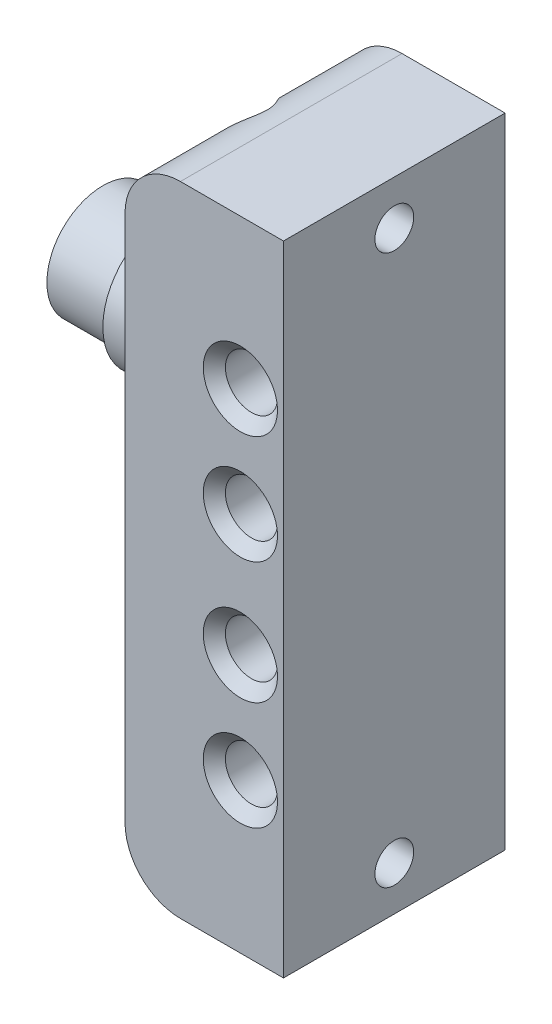
ISO-10303-21;
HEADER;
FILE_DESCRIPTION(('STEP AP214'),'2;1');
FILE_NAME('part.step','',(''),(''),'','','');
FILE_SCHEMA(('AUTOMOTIVE_DESIGN { 1 0 10303 214 1 1 1 1 }'));
ENDSEC;
DATA;
#1=APPLICATION_CONTEXT('core data for automotive mechanical design processes');
#2=APPLICATION_PROTOCOL_DEFINITION('international standard','automotive_design',2000,#1);
#3=PRODUCT_CONTEXT('',#1,'mechanical');
#4=PRODUCT('Part','Part','',(#3));
#5=PRODUCT_RELATED_PRODUCT_CATEGORY('part','',(#4));
#6=PRODUCT_DEFINITION_FORMATION('','',#4);
#7=PRODUCT_DEFINITION_CONTEXT('part definition',#1,'design');
#8=PRODUCT_DEFINITION('design','',#6,#7);
#9=PRODUCT_DEFINITION_SHAPE('','',#8);
#10=(LENGTH_UNIT() NAMED_UNIT(*) SI_UNIT(.MILLI.,.METRE.));
#11=(NAMED_UNIT(*) PLANE_ANGLE_UNIT() SI_UNIT($,.RADIAN.));
#12=(NAMED_UNIT(*) SI_UNIT($,.STERADIAN.) SOLID_ANGLE_UNIT());
#13=UNCERTAINTY_MEASURE_WITH_UNIT(LENGTH_MEASURE(1.E-05),#10,'distance_accuracy_value','');
#14=(GEOMETRIC_REPRESENTATION_CONTEXT(3) GLOBAL_UNCERTAINTY_ASSIGNED_CONTEXT((#13)) GLOBAL_UNIT_ASSIGNED_CONTEXT((#10,
#11,#12)) REPRESENTATION_CONTEXT('',''));
#15=CARTESIAN_POINT('',(0.,0.,0.));
#16=DIRECTION('',(0.,0.,1.));
#17=DIRECTION('',(1.,0.,0.));
#18=AXIS2_PLACEMENT_3D('',#15,#16,#17);
#19=CARTESIAN_POINT('',(-28.79,-25.225,2.));
#20=DIRECTION('',(0.,0.,-1.));
#21=DIRECTION('',(-1.,0.,0.));
#22=AXIS2_PLACEMENT_3D('',#19,#20,#21);
#23=PLANE('',#22);
#24=CARTESIAN_POINT('',(-28.79,-25.225,2.));
#25=DIRECTION('',(0.,0.,1.));
#26=DIRECTION('',(-1.,0.,0.));
#27=AXIS2_PLACEMENT_3D('',#24,#25,#26);
#28=CIRCLE('',#27,2.35);
#29=CARTESIAN_POINT('',(-31.14,-25.225,2.));
#30=VERTEX_POINT('',#29);
#31=EDGE_CURVE('E271',#30,#30,#28,.T.);
#32=ORIENTED_EDGE('',*,*,#31,.T.);
#33=EDGE_LOOP('',(#32));
#34=FACE_BOUND('',#33,.T.);
#35=ADVANCED_FACE('F41',(#34),#23,.F.);
#36=CARTESIAN_POINT('',(-28.79,-15.425,2.));
#37=DIRECTION('',(0.,0.,1.));
#38=DIRECTION('',(1.,0.,0.));
#39=AXIS2_PLACEMENT_3D('',#36,#37,#38);
#40=PLANE('',#39);
#41=CARTESIAN_POINT('',(-28.79,-15.425,2.));
#42=DIRECTION('',(0.,0.,1.));
#43=DIRECTION('',(1.,0.,0.));
#44=AXIS2_PLACEMENT_3D('',#41,#42,#43);
#45=CIRCLE('',#44,2.35);
#46=CARTESIAN_POINT('',(-26.44,-15.425,2.));
#47=VERTEX_POINT('',#46);
#48=EDGE_CURVE('E273',#47,#47,#45,.T.);
#49=ORIENTED_EDGE('',*,*,#48,.T.);
#50=EDGE_LOOP('',(#49));
#51=FACE_BOUND('',#50,.T.);
#52=ADVANCED_FACE('F188',(#51),#40,.T.);
#53=CARTESIAN_POINT('',(-28.79,5.375,2.));
#54=DIRECTION('',(0.,0.,1.));
#55=DIRECTION('',(1.,0.,0.));
#56=AXIS2_PLACEMENT_3D('',#53,#54,#55);
#57=PLANE('',#56);
#58=CARTESIAN_POINT('',(-28.79,5.375,2.));
#59=DIRECTION('',(0.,0.,1.));
#60=DIRECTION('',(1.,0.,0.));
#61=AXIS2_PLACEMENT_3D('',#58,#59,#60);
#62=CIRCLE('',#61,2.35);
#63=CARTESIAN_POINT('',(-26.44,5.375,2.));
#64=VERTEX_POINT('',#63);
#65=EDGE_CURVE('E276',#64,#64,#62,.T.);
#66=ORIENTED_EDGE('',*,*,#65,.T.);
#67=EDGE_LOOP('',(#66));
#68=FACE_BOUND('',#67,.T.);
#69=ADVANCED_FACE('F191',(#68),#57,.T.);
#70=CARTESIAN_POINT('',(-28.79,-4.425,2.));
#71=DIRECTION('',(0.,0.,-1.));
#72=DIRECTION('',(-1.,0.,0.));
#73=AXIS2_PLACEMENT_3D('',#70,#71,#72);
#74=PLANE('',#73);
#75=CARTESIAN_POINT('',(-28.79,-4.425,2.));
#76=DIRECTION('',(0.,0.,1.));
#77=DIRECTION('',(-1.,0.,0.));
#78=AXIS2_PLACEMENT_3D('',#75,#76,#77);
#79=CIRCLE('',#78,2.35);
#80=CARTESIAN_POINT('',(-31.14,-4.425,2.));
#81=VERTEX_POINT('',#80);
#82=EDGE_CURVE('E272',#81,#81,#79,.T.);
#83=ORIENTED_EDGE('',*,*,#82,.T.);
#84=EDGE_LOOP('',(#83));
#85=FACE_BOUND('',#84,.T.);
#86=ADVANCED_FACE('F166',(#85),#74,.F.);
#87=CARTESIAN_POINT('',(-28.2,-34.725,0.));
#88=DIRECTION('',(-1.,0.,0.));
#89=DIRECTION('',(0.,0.,1.));
#90=AXIS2_PLACEMENT_3D('',#87,#88,#89);
#91=CYLINDRICAL_SURFACE('',#90,3.5);
#92=CARTESIAN_POINT('',(-28.2,-34.725,0.));
#93=DIRECTION('',(-1.,0.,0.));
#94=DIRECTION('',(0.,0.,1.));
#95=AXIS2_PLACEMENT_3D('',#92,#93,#94);
#96=CIRCLE('',#95,3.5);
#97=CARTESIAN_POINT('',(-28.2,-34.725,3.5));
#98=VERTEX_POINT('',#97);
#99=EDGE_CURVE('E332',#98,#98,#96,.T.);
#100=ORIENTED_EDGE('',*,*,#99,.F.);
#101=EDGE_LOOP('',(#100));
#102=FACE_BOUND('',#101,.T.);
#103=CARTESIAN_POINT('',(-39.2,-34.725,0.));
#104=DIRECTION('',(-1.,0.,0.));
#105=DIRECTION('',(0.,0.,1.));
#106=AXIS2_PLACEMENT_3D('',#103,#104,#105);
#107=CIRCLE('',#106,3.5);
#108=CARTESIAN_POINT('',(-39.2,-33.725,3.35410196624969));
#109=VERTEX_POINT('',#108);
#110=CARTESIAN_POINT('',(-39.2,-33.725,-3.35410196624969));
#111=VERTEX_POINT('',#110);
#112=EDGE_CURVE('E125',#109,#111,#107,.T.);
#113=ORIENTED_EDGE('',*,*,#112,.T.);
#114=CARTESIAN_POINT('',(-39.2,-33.725,-3.35410196624969));
#115=CARTESIAN_POINT('',(-39.2000160264056,-33.8056918722298,-3.37817608662892));
#116=CARTESIAN_POINT('',(-39.1980469611626,-33.8872634053079,-3.39930887244822));
#117=CARTESIAN_POINT('',(-39.1900009199547,-34.0515100988851,-3.43561574208992));
#118=CARTESIAN_POINT('',(-39.1839245016946,-34.1341851080582,-3.45079063444503));
#119=CARTESIAN_POINT('',(-39.167566505004,-34.2995968081651,-3.47505234239928));
#120=CARTESIAN_POINT('',(-39.1573057935166,-34.3823311881041,-3.48416878642896));
#121=CARTESIAN_POINT('',(-39.1325801743489,-34.5475862223208,-3.49648405549747));
#122=CARTESIAN_POINT('',(-39.1181154026825,-34.6301068834257,-3.49968307195793));
#123=CARTESIAN_POINT('',(-39.0684895977402,-34.8764071037975,-3.50056372557546));
#124=CARTESIAN_POINT('',(-39.027082565653,-35.0390727454298,-3.48955001998578));
#125=CARTESIAN_POINT('',(-38.9291670846592,-35.3567875376094,-3.44625191526512));
#126=CARTESIAN_POINT('',(-38.8726455541537,-35.5118299519812,-3.41394905473086));
#127=CARTESIAN_POINT('',(-38.7441548180571,-35.8176853329573,-3.32900773254836));
#128=CARTESIAN_POINT('',(-38.6716297652167,-35.9680361871071,-3.27556101848378));
#129=CARTESIAN_POINT('',(-38.5155892350928,-36.2553045997635,-3.1516141690238));
#130=CARTESIAN_POINT('',(-38.432071768211,-36.3922197185872,-3.08111094450373));
#131=CARTESIAN_POINT('',(-38.278329767841,-36.6200354578484,-2.94480837625694));
#132=CARTESIAN_POINT('',(-38.2098506918739,-36.7139996098179,-2.8820767515411));
#133=CARTESIAN_POINT('',(-38.0693421220452,-36.8937857551189,-2.74933700166646));
#134=CARTESIAN_POINT('',(-37.9973123540257,-36.9796071182243,-2.67932831416343));
#135=CARTESIAN_POINT('',(-37.8504700092465,-37.1435134524916,-2.53238392253014));
#136=CARTESIAN_POINT('',(-37.7756459409746,-37.2215601528249,-2.4554171976463));
#137=CARTESIAN_POINT('',(-37.6246953538901,-37.3695337241203,-2.29528314537197));
#138=CARTESIAN_POINT('',(-37.5485691894202,-37.4394627650606,-2.2121174848612));
#139=CARTESIAN_POINT('',(-37.3946069274499,-37.5727360490375,-2.0378178311224));
#140=CARTESIAN_POINT('',(-37.3167697193318,-37.6359035839177,-1.94654968503268));
#141=CARTESIAN_POINT('',(-37.1626653242411,-37.7538992818809,-1.75733232391005));
#142=CARTESIAN_POINT('',(-37.0863995972157,-37.8087199680726,-1.65937723130525));
#143=CARTESIAN_POINT('',(-36.9383453416874,-37.9094264234791,-1.45676479277119));
#144=CARTESIAN_POINT('',(-36.8665331592542,-37.9553627532233,-1.352150165735));
#145=CARTESIAN_POINT('',(-36.7306729393412,-38.0380001058043,-1.13469573592675));
#146=CARTESIAN_POINT('',(-36.6666083004968,-38.0747210636847,-1.02187438079353));
#147=CARTESIAN_POINT('',(-36.5662725516335,-38.1299065523333,-0.81549199314612));
#148=CARTESIAN_POINT('',(-36.527040455067,-38.1506399208466,-0.724013452631849));
#149=CARTESIAN_POINT('',(-36.4603235561067,-38.1850841032396,-0.53567095406823));
#150=CARTESIAN_POINT('',(-36.4328106835851,-38.198811713276,-0.438820499645125));
#151=CARTESIAN_POINT('',(-36.39347698733,-38.2182378937676,-0.239574875423605));
#152=CARTESIAN_POINT('',(-36.3818806549605,-38.223821668507,-0.137121163931312));
#153=CARTESIAN_POINT('',(-36.3777175169832,-38.2258396460294,0.0682627194065828));
#154=CARTESIAN_POINT('',(-36.3851460436285,-38.2222760931077,0.171192768197713));
#155=CARTESIAN_POINT('',(-36.4181896995228,-38.2060662624217,0.379056510528692));
#156=CARTESIAN_POINT('',(-36.4447905494874,-38.1929272473342,0.483784765034481));
#157=CARTESIAN_POINT('',(-36.512171257485,-38.1584265208731,0.687247502550666));
#158=CARTESIAN_POINT('',(-36.5529968401183,-38.1370382687907,0.785961435922686));
#159=CARTESIAN_POINT('',(-36.6383820293807,-38.0903603359019,0.965327604639561));
#160=CARTESIAN_POINT('',(-36.6818783213233,-38.0658650492491,1.04671405802001));
#161=CARTESIAN_POINT('',(-36.7737068745109,-38.0120581284813,1.20509285300423));
#162=CARTESIAN_POINT('',(-36.8220429872727,-37.9827426463623,1.28208161718893));
#163=CARTESIAN_POINT('',(-36.9219554708844,-37.9195754092407,1.43224919199572));
#164=CARTESIAN_POINT('',(-36.9735392409876,-37.8857130805785,1.50541855259418));
#165=CARTESIAN_POINT('',(-37.0786669849811,-37.8136847636042,1.64815506921639));
#166=CARTESIAN_POINT('',(-37.1322115200896,-37.7755175365204,1.71772117992729));
#167=CARTESIAN_POINT('',(-37.2678781845527,-37.6744880510761,1.88804554011757));
#168=CARTESIAN_POINT('',(-37.3506861825534,-37.6089377409671,1.98667604549235));
#169=CARTESIAN_POINT('',(-37.5165472493566,-37.4683089303726,2.17674741479225));
#170=CARTESIAN_POINT('',(-37.5996004169225,-37.3932258595337,2.26818479578765));
#171=CARTESIAN_POINT('',(-37.7641268202402,-37.2335772596777,2.44357809309429));
#172=CARTESIAN_POINT('',(-37.8456023431491,-37.1490268870951,2.52754559202308));
#173=CARTESIAN_POINT('',(-38.0056165771868,-36.9702561781256,2.68760499633591));
#174=CARTESIAN_POINT('',(-38.0841552747118,-36.8760357969536,2.76369686524199));
#175=CARTESIAN_POINT('',(-38.2730237930044,-36.6309249532107,2.94107408768805));
#176=CARTESIAN_POINT('',(-38.380842113461,-36.4742920607192,3.03727697282755));
#177=CARTESIAN_POINT('',(-38.5820484612636,-36.1406769849787,3.20635748058334));
#178=CARTESIAN_POINT('',(-38.6754609287314,-35.9637301752516,3.27927483825895));
#179=CARTESIAN_POINT('',(-38.8286798869147,-35.6233998676809,3.38659330985728));
#180=CARTESIAN_POINT('',(-38.8914992900905,-35.4628123378511,3.42543132160184));
#181=CARTESIAN_POINT('',(-38.9735565962364,-35.2152205006361,3.46651221271091));
#182=CARTESIAN_POINT('',(-38.9988804286525,-35.1315713281892,3.47734315884281));
#183=CARTESIAN_POINT('',(-39.0452185445154,-34.9625457282622,3.49295907466684));
#184=CARTESIAN_POINT('',(-39.0662345550765,-34.8771700081412,3.49774647135727));
#185=CARTESIAN_POINT('',(-39.1042658976886,-34.7029302023029,3.50104482640362));
#186=CARTESIAN_POINT('',(-39.1211544279725,-34.614034962628,3.4993784344717));
#187=CARTESIAN_POINT('',(-39.1500367204929,-34.4358354417537,3.48917623064729));
#188=CARTESIAN_POINT('',(-39.162030237518,-34.3465311402892,3.48064007468371));
#189=CARTESIAN_POINT('',(-39.181175186988,-34.1677367016068,3.45653554235269));
#190=CARTESIAN_POINT('',(-39.1882935631283,-34.0782493435255,3.4409203282806));
#191=CARTESIAN_POINT('',(-39.1977180254418,-33.9004968943384,3.40271995934472));
#192=CARTESIAN_POINT('',(-39.2000230836039,-33.8122320683346,3.38013331673033));
#193=CARTESIAN_POINT('',(-39.2,-33.725,3.35410196624969));
#194=B_SPLINE_CURVE_WITH_KNOTS('',3,(#114,#115,#116,#117,#118,#119,#120,#121,#122,#123,#124,
#125,#126,#127,#128,#129,#130,#131,#132,#133,#134,#135,#136,#137,#138,#139,#140,#141,#142,#143,
#144,#145,#146,#147,#148,#149,#150,#151,#152,#153,#154,#155,#156,#157,#158,#159,#160,#161,#162,
#163,#164,#165,#166,#167,#168,#169,#170,#171,#172,#173,#174,#175,#176,#177,#178,#179,#180,#181,
#182,#183,#184,#185,#186,#187,#188,#189,#190,#191,#192,#193),.UNSPECIFIED.,.F.,.F.,(4,2,2,2,2,2,
2,2,2,2,2,2,2,2,2,2,2,2,2,2,2,2,2,2,2,2,2,2,2,2,2,2,2,2,2,2,2,2,2,4),(0.,0.252543095169952,
0.505051906412445,0.756316570520194,1.00757310637814,1.50964202898069,2.01214690662392,
2.53607500415081,3.06009806204156,3.45594262488461,3.85181779988976,4.24955423659872,
4.64718410605718,5.05347927216968,5.46013627247129,5.86440612174954,6.26779375073897,
6.57202558871335,6.87552456980166,7.18326166171455,7.49092325760125,7.81564671098216,
8.14142374884944,8.42745323391216,8.71371217741542,9.00064873145842,9.28766806565673,
9.72064457382403,10.1538294562032,10.5863304986328,11.01883354421,11.6556795065662,
12.2914328574583,12.8192724515774,13.0831930755278,13.3470076791855,13.6181226729593,
13.8892512463311,14.1622004970802,14.4352080373907),.UNSPECIFIED.);
#195=EDGE_CURVE('E147',#111,#109,#194,.T.);
#196=ORIENTED_EDGE('',*,*,#195,.T.);
#197=EDGE_LOOP('',(#113,#196));
#198=FACE_BOUND('',#197,.T.);
#199=ADVANCED_FACE('F160',(#102,#198),#91,.F.);
#200=CARTESIAN_POINT('',(-28.2,-34.725,0.));
#201=DIRECTION('',(-1.,0.,0.));
#202=DIRECTION('',(0.,0.,1.));
#203=AXIS2_PLACEMENT_3D('',#200,#201,#202);
#204=PLANE('',#203);
#205=ORIENTED_EDGE('',*,*,#99,.T.);
#206=EDGE_LOOP('',(#205));
#207=FACE_BOUND('',#206,.T.);
#208=CARTESIAN_POINT('',(-28.2,-34.725,0.));
#209=DIRECTION('',(-1.,0.,0.));
#210=DIRECTION('',(0.,0.,1.));
#211=AXIS2_PLACEMENT_3D('',#208,#209,#210);
#212=CIRCLE('',#211,1.75);
#213=CARTESIAN_POINT('',(-28.2,-34.725,1.75));
#214=VERTEX_POINT('',#213);
#215=EDGE_CURVE('E317',#214,#214,#212,.F.);
#216=ORIENTED_EDGE('',*,*,#215,.T.);
#217=EDGE_LOOP('',(#216));
#218=FACE_BOUND('',#217,.T.);
#219=ADVANCED_FACE('F165',(#207,#218),#204,.T.);
#220=CARTESIAN_POINT('',(-16.9,-34.725,0.));
#221=DIRECTION('',(-1.,0.,0.));
#222=DIRECTION('',(0.,0.,1.));
#223=AXIS2_PLACEMENT_3D('',#220,#221,#222);
#224=CYLINDRICAL_SURFACE('',#223,1.75);
#225=CARTESIAN_POINT('',(-24.9,-34.725,0.));
#226=DIRECTION('',(-1.,0.,0.));
#227=DIRECTION('',(0.,0.,1.));
#228=AXIS2_PLACEMENT_3D('',#225,#226,#227);
#229=CIRCLE('',#228,1.75);
#230=CARTESIAN_POINT('',(-24.9,-34.725,1.75));
#231=VERTEX_POINT('',#230);
#232=EDGE_CURVE('E346',#231,#231,#229,.F.);
#233=ORIENTED_EDGE('',*,*,#232,.T.);
#234=EDGE_LOOP('',(#233));
#235=FACE_BOUND('',#234,.T.);
#236=ORIENTED_EDGE('',*,*,#215,.F.);
#237=EDGE_LOOP('',(#236));
#238=FACE_BOUND('',#237,.T.);
#239=ADVANCED_FACE('F172',(#235,#238),#224,.F.);
#240=CARTESIAN_POINT('',(-28.2,14.875,0.));
#241=DIRECTION('',(-1.,0.,0.));
#242=DIRECTION('',(0.,0.,1.));
#243=AXIS2_PLACEMENT_3D('',#240,#241,#242);
#244=CYLINDRICAL_SURFACE('',#243,3.5);
#245=CARTESIAN_POINT('',(-28.2,14.875,0.));
#246=DIRECTION('',(-1.,0.,0.));
#247=DIRECTION('',(0.,0.,1.));
#248=AXIS2_PLACEMENT_3D('',#245,#246,#247);
#249=CIRCLE('',#248,3.5);
#250=CARTESIAN_POINT('',(-28.2,14.875,3.49999999999999));
#251=VERTEX_POINT('',#250);
#252=EDGE_CURVE('E124',#251,#251,#249,.T.);
#253=ORIENTED_EDGE('',*,*,#252,.F.);
#254=EDGE_LOOP('',(#253));
#255=FACE_BOUND('',#254,.T.);
#256=CARTESIAN_POINT('',(-39.2,14.875,0.));
#257=DIRECTION('',(-1.,0.,0.));
#258=DIRECTION('',(0.,0.,1.));
#259=AXIS2_PLACEMENT_3D('',#256,#257,#258);
#260=CIRCLE('',#259,3.5);
#261=CARTESIAN_POINT('',(-39.2,13.875,-3.35410196624969));
#262=VERTEX_POINT('',#261);
#263=CARTESIAN_POINT('',(-39.2,13.875,3.35410196624968));
#264=VERTEX_POINT('',#263);
#265=EDGE_CURVE('E109',#262,#264,#260,.T.);
#266=ORIENTED_EDGE('',*,*,#265,.T.);
#267=CARTESIAN_POINT('',(-39.2,13.875,3.35410196624968));
#268=CARTESIAN_POINT('',(-39.2000160264056,13.9556918722298,3.37817608662892));
#269=CARTESIAN_POINT('',(-39.1980469611626,14.0372634053079,3.39930887244821));
#270=CARTESIAN_POINT('',(-39.1900009199547,14.2015100988851,3.43561574208992));
#271=CARTESIAN_POINT('',(-39.1839245016946,14.2841851080582,3.45079063444503));
#272=CARTESIAN_POINT('',(-39.167566505004,14.4495968081651,3.47505234239927));
#273=CARTESIAN_POINT('',(-39.1573057935166,14.5323311881041,3.48416878642895));
#274=CARTESIAN_POINT('',(-39.1325801743489,14.6975862223208,3.49648405549746));
#275=CARTESIAN_POINT('',(-39.1181154026825,14.7801068834257,3.49968307195792));
#276=CARTESIAN_POINT('',(-39.0684895977402,15.0264071037975,3.50056372557545));
#277=CARTESIAN_POINT('',(-39.027082565653,15.1890727454298,3.48955001998577));
#278=CARTESIAN_POINT('',(-38.9291670846592,15.5067875376094,3.44625191526512));
#279=CARTESIAN_POINT('',(-38.8726455541537,15.6618299519812,3.41394905473085));
#280=CARTESIAN_POINT('',(-38.7441548180571,15.9676853329573,3.32900773254835));
#281=CARTESIAN_POINT('',(-38.6716297652167,16.1180361871071,3.27556101848378));
#282=CARTESIAN_POINT('',(-38.5155892350928,16.4053045997635,3.15161416902379));
#283=CARTESIAN_POINT('',(-38.432071768211,16.5422197185872,3.08111094450372));
#284=CARTESIAN_POINT('',(-38.278329767841,16.7700354578484,2.94480837625693));
#285=CARTESIAN_POINT('',(-38.2098506918739,16.8639996098179,2.88207675154109));
#286=CARTESIAN_POINT('',(-38.0693421220452,17.0437857551189,2.74933700166645));
#287=CARTESIAN_POINT('',(-37.9973123540257,17.1296071182243,2.67932831416342));
#288=CARTESIAN_POINT('',(-37.8504700092465,17.2935134524916,2.53238392253013));
#289=CARTESIAN_POINT('',(-37.7756459409746,17.3715601528249,2.45541719764629));
#290=CARTESIAN_POINT('',(-37.6246953538901,17.5195337241203,2.29528314537196));
#291=CARTESIAN_POINT('',(-37.5485691894202,17.5894627650606,2.21211748486118));
#292=CARTESIAN_POINT('',(-37.3946069274499,17.7227360490376,2.03781783112238));
#293=CARTESIAN_POINT('',(-37.3167697193318,17.7859035839177,1.94654968503267));
#294=CARTESIAN_POINT('',(-37.1626653242411,17.9038992818809,1.75733232391004));
#295=CARTESIAN_POINT('',(-37.0863995972157,17.9587199680726,1.65937723130524));
#296=CARTESIAN_POINT('',(-36.9383453416874,18.0594264234791,1.45676479277118));
#297=CARTESIAN_POINT('',(-36.8665331592542,18.1053627532233,1.35215016573499));
#298=CARTESIAN_POINT('',(-36.7306729393412,18.1880001058043,1.13469573592674));
#299=CARTESIAN_POINT('',(-36.6666083004968,18.2247210636847,1.02187438079352));
#300=CARTESIAN_POINT('',(-36.5662725516335,18.2799065523333,0.815491993146112));
#301=CARTESIAN_POINT('',(-36.527040455067,18.3006399208466,0.724013452631843));
#302=CARTESIAN_POINT('',(-36.4603235561067,18.3350841032396,0.535670954068225));
#303=CARTESIAN_POINT('',(-36.4328106835851,18.348811713276,0.438820499645119));
#304=CARTESIAN_POINT('',(-36.39347698733,18.3682378937676,0.239574875423598));
#305=CARTESIAN_POINT('',(-36.3818806549605,18.373821668507,0.137121163931306));
#306=CARTESIAN_POINT('',(-36.3777175169832,18.3758396460294,-0.0682627194065885));
#307=CARTESIAN_POINT('',(-36.3851460436285,18.3722760931077,-0.171192768197719));
#308=CARTESIAN_POINT('',(-36.4181896995228,18.3560662624217,-0.379056510528699));
#309=CARTESIAN_POINT('',(-36.4447905494874,18.3429272473342,-0.48378476503449));
#310=CARTESIAN_POINT('',(-36.512171257485,18.3084265208731,-0.687247502550675));
#311=CARTESIAN_POINT('',(-36.5529968401183,18.2870382687907,-0.785961435922693));
#312=CARTESIAN_POINT('',(-36.6383820293807,18.2403603359019,-0.965327604639566));
#313=CARTESIAN_POINT('',(-36.6818783213233,18.2158650492491,-1.04671405802002));
#314=CARTESIAN_POINT('',(-36.7737068745109,18.1620581284813,-1.20509285300423));
#315=CARTESIAN_POINT('',(-36.8220429872727,18.1327426463623,-1.28208161718893));
#316=CARTESIAN_POINT('',(-36.9219554708844,18.0695754092407,-1.43224919199572));
#317=CARTESIAN_POINT('',(-36.9735392409876,18.0357130805785,-1.50541855259418));
#318=CARTESIAN_POINT('',(-37.0786669849811,17.9636847636042,-1.64815506921639));
#319=CARTESIAN_POINT('',(-37.1322115200896,17.9255175365204,-1.71772117992729));
#320=CARTESIAN_POINT('',(-37.2678781845527,17.8244880510761,-1.88804554011758));
#321=CARTESIAN_POINT('',(-37.3506861825534,17.7589377409671,-1.98667604549235));
#322=CARTESIAN_POINT('',(-37.5165472493566,17.6183089303726,-2.17674741479225));
#323=CARTESIAN_POINT('',(-37.5996004169225,17.5432258595337,-2.26818479578766));
#324=CARTESIAN_POINT('',(-37.7641268202402,17.3835772596777,-2.4435780930943));
#325=CARTESIAN_POINT('',(-37.8456023431491,17.2990268870951,-2.52754559202309));
#326=CARTESIAN_POINT('',(-38.0056165771868,17.1202561781256,-2.68760499633592));
#327=CARTESIAN_POINT('',(-38.0841552747118,17.0260357969536,-2.763696865242));
#328=CARTESIAN_POINT('',(-38.2730237930044,16.7809249532107,-2.94107408768806));
#329=CARTESIAN_POINT('',(-38.380842113461,16.6242920607192,-3.03727697282755));
#330=CARTESIAN_POINT('',(-38.5820484612636,16.2906769849787,-3.20635748058334));
#331=CARTESIAN_POINT('',(-38.6754609287314,16.1137301752516,-3.27927483825895));
#332=CARTESIAN_POINT('',(-38.8286798869147,15.7733998676809,-3.38659330985729));
#333=CARTESIAN_POINT('',(-38.8914992900905,15.6128123378511,-3.42543132160184));
#334=CARTESIAN_POINT('',(-38.9735565962364,15.3652205006361,-3.46651221271091));
#335=CARTESIAN_POINT('',(-38.9988804286525,15.2815713281892,-3.47734315884281));
#336=CARTESIAN_POINT('',(-39.0452185445154,15.1125457282622,-3.49295907466685));
#337=CARTESIAN_POINT('',(-39.0662345550765,15.0271700081412,-3.49774647135728));
#338=CARTESIAN_POINT('',(-39.1042658976886,14.8529302023029,-3.50104482640363));
#339=CARTESIAN_POINT('',(-39.1211544279725,14.764034962628,-3.49937843447171));
#340=CARTESIAN_POINT('',(-39.1500367204929,14.5858354417537,-3.48917623064729));
#341=CARTESIAN_POINT('',(-39.162030237518,14.4965311402892,-3.48064007468372));
#342=CARTESIAN_POINT('',(-39.181175186988,14.3177367016068,-3.4565355423527));
#343=CARTESIAN_POINT('',(-39.1882935631283,14.2282493435255,-3.44092032828061));
#344=CARTESIAN_POINT('',(-39.1977180254418,14.0504968943384,-3.40271995934473));
#345=CARTESIAN_POINT('',(-39.2000230836039,13.9622320683346,-3.38013331673034));
#346=CARTESIAN_POINT('',(-39.2,13.875,-3.35410196624969));
#347=B_SPLINE_CURVE_WITH_KNOTS('',3,(#267,#268,#269,#270,#271,#272,#273,#274,#275,#276,#277,
#278,#279,#280,#281,#282,#283,#284,#285,#286,#287,#288,#289,#290,#291,#292,#293,#294,#295,#296,
#297,#298,#299,#300,#301,#302,#303,#304,#305,#306,#307,#308,#309,#310,#311,#312,#313,#314,#315,
#316,#317,#318,#319,#320,#321,#322,#323,#324,#325,#326,#327,#328,#329,#330,#331,#332,#333,#334,
#335,#336,#337,#338,#339,#340,#341,#342,#343,#344,#345,#346),.UNSPECIFIED.,.F.,.F.,(4,2,2,2,2,2,
2,2,2,2,2,2,2,2,2,2,2,2,2,2,2,2,2,2,2,2,2,2,2,2,2,2,2,2,2,2,2,2,2,4),(0.,0.25254309516995,
0.505051906412441,0.756316570520194,1.00757310637814,1.50964202898068,2.01214690662391,
2.53607500415082,3.06009806204156,3.45594262488461,3.85181779988976,4.24955423659872,
4.64718410605719,5.05347927216968,5.46013627247129,5.86440612174953,6.26779375073896,
6.57202558871335,6.87552456980165,7.18326166171454,7.49092325760124,7.81564671098216,
8.14142374884944,8.42745323391214,8.7137121774154,9.00064873145841,9.28766806565672,
9.72064457382402,10.1538294562032,10.5863304986327,11.01883354421,11.6556795065662,
12.2914328574583,12.8192724515774,13.0831930755278,13.3470076791855,13.6181226729593,
13.8892512463311,14.1622004970802,14.4352080373907),.UNSPECIFIED.);
#348=EDGE_CURVE('E106',#264,#262,#347,.T.);
#349=ORIENTED_EDGE('',*,*,#348,.T.);
#350=EDGE_LOOP('',(#266,#349));
#351=FACE_BOUND('',#350,.T.);
#352=ADVANCED_FACE('F108',(#255,#351),#244,.F.);
#353=CARTESIAN_POINT('',(-28.2,14.875,0.));
#354=DIRECTION('',(-1.,0.,0.));
#355=DIRECTION('',(0.,0.,1.));
#356=AXIS2_PLACEMENT_3D('',#353,#354,#355);
#357=PLANE('',#356);
#358=ORIENTED_EDGE('',*,*,#252,.T.);
#359=EDGE_LOOP('',(#358));
#360=FACE_BOUND('',#359,.T.);
#361=CARTESIAN_POINT('',(-28.2,14.875,0.));
#362=DIRECTION('',(-1.,0.,0.));
#363=DIRECTION('',(0.,0.,1.));
#364=AXIS2_PLACEMENT_3D('',#361,#362,#363);
#365=CIRCLE('',#364,1.75);
#366=CARTESIAN_POINT('',(-28.2,14.875,1.74999999999999));
#367=VERTEX_POINT('',#366);
#368=EDGE_CURVE('E140',#367,#367,#365,.F.);
#369=ORIENTED_EDGE('',*,*,#368,.T.);
#370=EDGE_LOOP('',(#369));
#371=FACE_BOUND('',#370,.T.);
#372=ADVANCED_FACE('F181',(#360,#371),#357,.T.);
#373=CARTESIAN_POINT('',(-16.9,14.875,0.));
#374=DIRECTION('',(-1.,0.,0.));
#375=DIRECTION('',(0.,0.,1.));
#376=AXIS2_PLACEMENT_3D('',#373,#374,#375);
#377=CYLINDRICAL_SURFACE('',#376,1.75);
#378=CARTESIAN_POINT('',(-24.9,14.875,0.));
#379=DIRECTION('',(-1.,0.,0.));
#380=DIRECTION('',(0.,0.,1.));
#381=AXIS2_PLACEMENT_3D('',#378,#379,#380);
#382=CIRCLE('',#381,1.75);
#383=CARTESIAN_POINT('',(-24.9,14.875,1.74999999999999));
#384=VERTEX_POINT('',#383);
#385=EDGE_CURVE('E114',#384,#384,#382,.F.);
#386=ORIENTED_EDGE('',*,*,#385,.T.);
#387=EDGE_LOOP('',(#386));
#388=FACE_BOUND('',#387,.T.);
#389=ORIENTED_EDGE('',*,*,#368,.F.);
#390=EDGE_LOOP('',(#389));
#391=FACE_BOUND('',#390,.T.);
#392=ADVANCED_FACE('F177',(#388,#391),#377,.F.);
#393=CARTESIAN_POINT('',(-28.79,-25.225,2.));
#394=DIRECTION('',(0.,0.,1.));
#395=DIRECTION('',(1.,0.,0.));
#396=AXIS2_PLACEMENT_3D('',#393,#394,#395);
#397=CYLINDRICAL_SURFACE('',#396,2.35);
#398=CARTESIAN_POINT('',(-28.79,-25.225,8.99999999999998));
#399=DIRECTION('',(0.,0.,-1.));
#400=DIRECTION('',(-1.,0.,0.));
#401=AXIS2_PLACEMENT_3D('',#398,#399,#400);
#402=CIRCLE('',#401,2.35);
#403=CARTESIAN_POINT('',(-31.14,-25.225,8.99999999999998));
#404=VERTEX_POINT('',#403);
#405=EDGE_CURVE('E132',#404,#404,#402,.F.);
#406=ORIENTED_EDGE('',*,*,#405,.T.);
#407=EDGE_LOOP('',(#406));
#408=FACE_BOUND('',#407,.T.);
#409=ORIENTED_EDGE('',*,*,#31,.F.);
#410=EDGE_LOOP('',(#409));
#411=FACE_BOUND('',#410,.T.);
#412=ADVANCED_FACE('F180',(#408,#411),#397,.F.);
#413=CARTESIAN_POINT('',(-28.79,-15.425,2.));
#414=DIRECTION('',(0.,0.,1.));
#415=DIRECTION('',(1.,0.,0.));
#416=AXIS2_PLACEMENT_3D('',#413,#414,#415);
#417=CYLINDRICAL_SURFACE('',#416,2.35);
#418=CARTESIAN_POINT('',(-28.79,-15.425,9.));
#419=DIRECTION('',(0.,0.,-1.));
#420=DIRECTION('',(-1.,0.,0.));
#421=AXIS2_PLACEMENT_3D('',#418,#419,#420);
#422=CIRCLE('',#421,2.35);
#423=CARTESIAN_POINT('',(-31.14,-15.425,9.));
#424=VERTEX_POINT('',#423);
#425=EDGE_CURVE('E137',#424,#424,#422,.F.);
#426=ORIENTED_EDGE('',*,*,#425,.T.);
#427=EDGE_LOOP('',(#426));
#428=FACE_BOUND('',#427,.T.);
#429=ORIENTED_EDGE('',*,*,#48,.F.);
#430=EDGE_LOOP('',(#429));
#431=FACE_BOUND('',#430,.T.);
#432=ADVANCED_FACE('F183',(#428,#431),#417,.F.);
#433=CARTESIAN_POINT('',(-28.79,5.375,2.));
#434=DIRECTION('',(0.,0.,1.));
#435=DIRECTION('',(1.,0.,0.));
#436=AXIS2_PLACEMENT_3D('',#433,#434,#435);
#437=CYLINDRICAL_SURFACE('',#436,2.35);
#438=CARTESIAN_POINT('',(-28.79,5.375,9.));
#439=DIRECTION('',(0.,0.,-1.));
#440=DIRECTION('',(-1.,0.,0.));
#441=AXIS2_PLACEMENT_3D('',#438,#439,#440);
#442=CIRCLE('',#441,2.35);
#443=CARTESIAN_POINT('',(-31.14,5.375,9.));
#444=VERTEX_POINT('',#443);
#445=EDGE_CURVE('E313',#444,#444,#442,.F.);
#446=ORIENTED_EDGE('',*,*,#445,.T.);
#447=EDGE_LOOP('',(#446));
#448=FACE_BOUND('',#447,.T.);
#449=ORIENTED_EDGE('',*,*,#65,.F.);
#450=EDGE_LOOP('',(#449));
#451=FACE_BOUND('',#450,.T.);
#452=ADVANCED_FACE('F186',(#448,#451),#437,.F.);
#453=CARTESIAN_POINT('',(-28.79,-4.425,2.));
#454=DIRECTION('',(0.,0.,1.));
#455=DIRECTION('',(1.,0.,0.));
#456=AXIS2_PLACEMENT_3D('',#453,#454,#455);
#457=CYLINDRICAL_SURFACE('',#456,2.35);
#458=CARTESIAN_POINT('',(-28.79,-4.425,8.99999999999999));
#459=DIRECTION('',(0.,0.,-1.));
#460=DIRECTION('',(-1.,0.,0.));
#461=AXIS2_PLACEMENT_3D('',#458,#459,#460);
#462=CIRCLE('',#461,2.35);
#463=CARTESIAN_POINT('',(-31.14,-4.425,8.99999999999999));
#464=VERTEX_POINT('',#463);
#465=EDGE_CURVE('E298',#464,#464,#462,.F.);
#466=ORIENTED_EDGE('',*,*,#465,.T.);
#467=EDGE_LOOP('',(#466));
#468=FACE_BOUND('',#467,.T.);
#469=ORIENTED_EDGE('',*,*,#82,.F.);
#470=EDGE_LOOP('',(#469));
#471=FACE_BOUND('',#470,.T.);
#472=ADVANCED_FACE('F193',(#468,#471),#457,.F.);
#473=CARTESIAN_POINT('',(-34.2,-33.725,0.));
#474=DIRECTION('',(0.,0.,1.));
#475=DIRECTION('',(1.,0.,0.));
#476=AXIS2_PLACEMENT_3D('',#473,#474,#475);
#477=CYLINDRICAL_SURFACE('',#476,5.);
#478=CARTESIAN_POINT('',(-34.2,-33.725,-10.));
#479=DIRECTION('',(0.,0.,1.));
#480=DIRECTION('',(0.,-1.,0.));
#481=AXIS2_PLACEMENT_3D('',#478,#479,#480);
#482=CIRCLE('',#481,5.);
#483=CARTESIAN_POINT('',(-34.2,-38.725,-10.));
#484=VERTEX_POINT('',#483);
#485=CARTESIAN_POINT('',(-39.2,-33.725,-9.99999999999999));
#486=VERTEX_POINT('',#485);
#487=EDGE_CURVE('E608',#484,#486,#482,.F.);
#488=ORIENTED_EDGE('',*,*,#487,.F.);
#489=DIRECTION('',(0.,0.,1.));
#490=VECTOR('',#489,1.);
#491=CARTESIAN_POINT('',(-34.2,-38.725,10.));
#492=LINE('',#491,#490);
#493=CARTESIAN_POINT('',(-34.2,-38.725,10.));
#494=VERTEX_POINT('',#493);
#495=EDGE_CURVE('E610',#494,#484,#492,.F.);
#496=ORIENTED_EDGE('',*,*,#495,.F.);
#497=CARTESIAN_POINT('',(-34.2,-33.725,10.));
#498=DIRECTION('',(0.,0.,-1.));
#499=DIRECTION('',(-1.,0.,0.));
#500=AXIS2_PLACEMENT_3D('',#497,#498,#499);
#501=CIRCLE('',#500,5.);
#502=CARTESIAN_POINT('',(-39.2,-33.725,10.));
#503=VERTEX_POINT('',#502);
#504=EDGE_CURVE('E613',#503,#494,#501,.F.);
#505=ORIENTED_EDGE('',*,*,#504,.F.);
#506=DIRECTION('',(0.,0.,1.));
#507=VECTOR('',#506,1.);
#508=CARTESIAN_POINT('',(-39.2,-33.725,0.));
#509=LINE('',#508,#507);
#510=EDGE_CURVE('E134',#109,#503,#509,.T.);
#511=ORIENTED_EDGE('',*,*,#510,.F.);
#512=ORIENTED_EDGE('',*,*,#195,.F.);
#513=DIRECTION('',(0.,0.,1.));
#514=VECTOR('',#513,1.);
#515=CARTESIAN_POINT('',(-39.2,-33.725,0.));
#516=LINE('',#515,#514);
#517=EDGE_CURVE('E144',#486,#111,#516,.T.);
#518=ORIENTED_EDGE('',*,*,#517,.F.);
#519=EDGE_LOOP('',(#488,#496,#505,#511,#512,#518));
#520=FACE_BOUND('',#519,.T.);
#521=ADVANCED_FACE('F157',(#520),#477,.T.);
#522=CARTESIAN_POINT('',(-39.2,0.,0.));
#523=DIRECTION('',(-1.,0.,0.));
#524=DIRECTION('',(0.,0.,1.));
#525=AXIS2_PLACEMENT_3D('',#522,#523,#524);
#526=PLANE('',#525);
#527=CARTESIAN_POINT('',(-39.2,0.,0.));
#528=DIRECTION('',(-1.,0.,0.));
#529=DIRECTION('',(0.,0.,1.));
#530=AXIS2_PLACEMENT_3D('',#527,#528,#529);
#531=CIRCLE('',#530,9.);
#532=CARTESIAN_POINT('',(-39.2,0.,9.));
#533=VERTEX_POINT('',#532);
#534=EDGE_CURVE('E11',#533,#533,#531,.F.);
#535=ORIENTED_EDGE('',*,*,#534,.T.);
#536=EDGE_LOOP('',(#535));
#537=FACE_BOUND('',#536,.T.);
#538=DIRECTION('',(0.,-1.,0.));
#539=VECTOR('',#538,1.);
#540=CARTESIAN_POINT('',(-39.2,18.875,-10.));
#541=LINE('',#540,#539);
#542=CARTESIAN_POINT('',(-39.2,13.875,-10.));
#543=VERTEX_POINT('',#542);
#544=EDGE_CURVE('E283',#543,#486,#541,.T.);
#545=ORIENTED_EDGE('',*,*,#544,.T.);
#546=ORIENTED_EDGE('',*,*,#517,.T.);
#547=ORIENTED_EDGE('',*,*,#112,.F.);
#548=ORIENTED_EDGE('',*,*,#510,.T.);
#549=DIRECTION('',(0.,1.,0.));
#550=VECTOR('',#549,1.);
#551=CARTESIAN_POINT('',(-39.2,18.875,9.99999999999999));
#552=LINE('',#551,#550);
#553=CARTESIAN_POINT('',(-39.2,13.875,9.99999999999999));
#554=VERTEX_POINT('',#553);
#555=EDGE_CURVE('E285',#503,#554,#552,.T.);
#556=ORIENTED_EDGE('',*,*,#555,.T.);
#557=DIRECTION('',(0.,0.,-1.));
#558=VECTOR('',#557,1.);
#559=CARTESIAN_POINT('',(-39.2,13.875,-10.));
#560=LINE('',#559,#558);
#561=EDGE_CURVE('E123',#554,#264,#560,.T.);
#562=ORIENTED_EDGE('',*,*,#561,.T.);
#563=ORIENTED_EDGE('',*,*,#265,.F.);
#564=DIRECTION('',(0.,0.,-1.));
#565=VECTOR('',#564,1.);
#566=CARTESIAN_POINT('',(-39.2,13.875,-10.));
#567=LINE('',#566,#565);
#568=EDGE_CURVE('E120',#262,#543,#567,.T.);
#569=ORIENTED_EDGE('',*,*,#568,.T.);
#570=EDGE_LOOP('',(#545,#546,#547,#548,#556,#562,#563,#569));
#571=FACE_BOUND('',#570,.T.);
#572=ADVANCED_FACE('F119',(#537,#571),#526,.T.);
#573=CARTESIAN_POINT('',(-34.2,13.875,0.));
#574=DIRECTION('',(0.,0.,1.));
#575=DIRECTION('',(1.,0.,0.));
#576=AXIS2_PLACEMENT_3D('',#573,#574,#575);
#577=CYLINDRICAL_SURFACE('',#576,5.);
#578=CARTESIAN_POINT('',(-34.2,13.875,10.));
#579=DIRECTION('',(0.,0.,-1.));
#580=DIRECTION('',(-1.,0.,0.));
#581=AXIS2_PLACEMENT_3D('',#578,#579,#580);
#582=CIRCLE('',#581,5.);
#583=CARTESIAN_POINT('',(-34.2,18.875,10.));
#584=VERTEX_POINT('',#583);
#585=EDGE_CURVE('E155',#584,#554,#582,.F.);
#586=ORIENTED_EDGE('',*,*,#585,.F.);
#587=DIRECTION('',(0.,0.,-1.));
#588=VECTOR('',#587,1.);
#589=CARTESIAN_POINT('',(-34.2,18.875,9.99999999999999));
#590=LINE('',#589,#588);
#591=CARTESIAN_POINT('',(-34.2,18.875,-10.));
#592=VERTEX_POINT('',#591);
#593=EDGE_CURVE('E115',#592,#584,#590,.F.);
#594=ORIENTED_EDGE('',*,*,#593,.F.);
#595=CARTESIAN_POINT('',(-34.2,13.875,-10.));
#596=DIRECTION('',(0.,0.,1.));
#597=DIRECTION('',(0.,-1.,0.));
#598=AXIS2_PLACEMENT_3D('',#595,#596,#597);
#599=CIRCLE('',#598,5.);
#600=EDGE_CURVE('E131',#543,#592,#599,.F.);
#601=ORIENTED_EDGE('',*,*,#600,.F.);
#602=ORIENTED_EDGE('',*,*,#568,.F.);
#603=ORIENTED_EDGE('',*,*,#348,.F.);
#604=ORIENTED_EDGE('',*,*,#561,.F.);
#605=EDGE_LOOP('',(#586,#594,#601,#602,#603,#604));
#606=FACE_BOUND('',#605,.T.);
#607=ADVANCED_FACE('F129',(#606),#577,.T.);
#608=CARTESIAN_POINT('',(20.,18.875,10.));
#609=DIRECTION('',(0.,-1.,0.));
#610=DIRECTION('',(0.,0.,-1.));
#611=AXIS2_PLACEMENT_3D('',#608,#609,#610);
#612=PLANE('',#611);
#613=DIRECTION('',(1.,0.,0.));
#614=VECTOR('',#613,1.);
#615=CARTESIAN_POINT('',(20.,18.875,10.));
#616=LINE('',#615,#614);
#617=CARTESIAN_POINT('',(-24.9,18.875,10.));
#618=VERTEX_POINT('',#617);
#619=EDGE_CURVE('E287',#584,#618,#616,.T.);
#620=ORIENTED_EDGE('',*,*,#619,.T.);
#621=DIRECTION('',(0.,0.,-1.));
#622=VECTOR('',#621,1.);
#623=CARTESIAN_POINT('',(-24.9,18.875,10.));
#624=LINE('',#623,#622);
#625=CARTESIAN_POINT('',(-24.9,18.875,-10.));
#626=VERTEX_POINT('',#625);
#627=EDGE_CURVE('E352',#618,#626,#624,.T.);
#628=ORIENTED_EDGE('',*,*,#627,.T.);
#629=DIRECTION('',(1.,0.,0.));
#630=VECTOR('',#629,1.);
#631=CARTESIAN_POINT('',(20.,18.875,-10.));
#632=LINE('',#631,#630);
#633=EDGE_CURVE('E290',#592,#626,#632,.T.);
#634=ORIENTED_EDGE('',*,*,#633,.F.);
#635=ORIENTED_EDGE('',*,*,#593,.T.);
#636=EDGE_LOOP('',(#620,#628,#634,#635));
#637=FACE_BOUND('',#636,.T.);
#638=ADVANCED_FACE('F220',(#637),#612,.F.);
#639=CARTESIAN_POINT('',(-0.343933370909367,-38.725,10.));
#640=DIRECTION('',(0.,-1.,0.));
#641=DIRECTION('',(0.,0.,-1.));
#642=AXIS2_PLACEMENT_3D('',#639,#640,#641);
#643=PLANE('',#642);
#644=DIRECTION('',(0.,0.,-1.));
#645=VECTOR('',#644,1.);
#646=CARTESIAN_POINT('',(-24.9,-38.725,10.));
#647=LINE('',#646,#645);
#648=CARTESIAN_POINT('',(-24.9,-38.725,10.));
#649=VERTEX_POINT('',#648);
#650=CARTESIAN_POINT('',(-24.9,-38.725,-10.));
#651=VERTEX_POINT('',#650);
#652=EDGE_CURVE('E349',#649,#651,#647,.T.);
#653=ORIENTED_EDGE('',*,*,#652,.F.);
#654=DIRECTION('',(1.,0.,0.));
#655=VECTOR('',#654,1.);
#656=CARTESIAN_POINT('',(-0.343933370909367,-38.725,10.));
#657=LINE('',#656,#655);
#658=EDGE_CURVE('E292',#494,#649,#657,.T.);
#659=ORIENTED_EDGE('',*,*,#658,.F.);
#660=ORIENTED_EDGE('',*,*,#495,.T.);
#661=DIRECTION('',(1.,0.,0.));
#662=VECTOR('',#661,1.);
#663=CARTESIAN_POINT('',(-0.343933370909367,-38.725,-10.));
#664=LINE('',#663,#662);
#665=EDGE_CURVE('E295',#484,#651,#664,.T.);
#666=ORIENTED_EDGE('',*,*,#665,.T.);
#667=EDGE_LOOP('',(#653,#659,#660,#666));
#668=FACE_BOUND('',#667,.T.);
#669=ADVANCED_FACE('F223',(#668),#643,.T.);
#670=CARTESIAN_POINT('',(-28.79,-25.225,8.99999999999998));
#671=DIRECTION('',(0.,0.,1.));
#672=DIRECTION('',(1.,0.,0.));
#673=AXIS2_PLACEMENT_3D('',#670,#671,#672);
#674=CONICAL_SURFACE('',#673,2.35,0.785398163397451);
#675=CARTESIAN_POINT('',(-28.79,-25.225,10.));
#676=DIRECTION('',(0.,0.,-1.));
#677=DIRECTION('',(-1.,0.,0.));
#678=AXIS2_PLACEMENT_3D('',#675,#676,#677);
#679=CIRCLE('',#678,3.35000000000002);
#680=CARTESIAN_POINT('',(-32.14,-25.225,10.));
#681=VERTEX_POINT('',#680);
#682=EDGE_CURVE('E266',#681,#681,#679,.T.);
#683=ORIENTED_EDGE('',*,*,#682,.F.);
#684=EDGE_LOOP('',(#683));
#685=FACE_BOUND('',#684,.T.);
#686=ORIENTED_EDGE('',*,*,#405,.F.);
#687=EDGE_LOOP('',(#686));
#688=FACE_BOUND('',#687,.T.);
#689=ADVANCED_FACE('F227',(#685,#688),#674,.F.);
#690=CARTESIAN_POINT('',(-28.79,-15.425,9.));
#691=DIRECTION('',(0.,0.,1.));
#692=DIRECTION('',(1.,0.,0.));
#693=AXIS2_PLACEMENT_3D('',#690,#691,#692);
#694=CONICAL_SURFACE('',#693,2.35,0.78539816339745);
#695=CARTESIAN_POINT('',(-28.79,-15.425,10.));
#696=DIRECTION('',(0.,0.,-1.));
#697=DIRECTION('',(-1.,0.,0.));
#698=AXIS2_PLACEMENT_3D('',#695,#696,#697);
#699=CIRCLE('',#698,3.35);
#700=CARTESIAN_POINT('',(-32.14,-15.425,10.));
#701=VERTEX_POINT('',#700);
#702=EDGE_CURVE('E304',#701,#701,#699,.T.);
#703=ORIENTED_EDGE('',*,*,#702,.F.);
#704=EDGE_LOOP('',(#703));
#705=FACE_BOUND('',#704,.T.);
#706=ORIENTED_EDGE('',*,*,#425,.F.);
#707=EDGE_LOOP('',(#706));
#708=FACE_BOUND('',#707,.T.);
#709=ADVANCED_FACE('F249',(#705,#708),#694,.F.);
#710=CARTESIAN_POINT('',(-28.79,5.375,9.));
#711=DIRECTION('',(0.,0.,1.));
#712=DIRECTION('',(1.,0.,0.));
#713=AXIS2_PLACEMENT_3D('',#710,#711,#712);
#714=CONICAL_SURFACE('',#713,2.35,0.78539816339745);
#715=CARTESIAN_POINT('',(-28.79,5.375,10.));
#716=DIRECTION('',(0.,0.,-1.));
#717=DIRECTION('',(-1.,0.,0.));
#718=AXIS2_PLACEMENT_3D('',#715,#716,#717);
#719=CIRCLE('',#718,3.35);
#720=CARTESIAN_POINT('',(-32.14,5.375,10.));
#721=VERTEX_POINT('',#720);
#722=EDGE_CURVE('E307',#721,#721,#719,.T.);
#723=ORIENTED_EDGE('',*,*,#722,.F.);
#724=EDGE_LOOP('',(#723));
#725=FACE_BOUND('',#724,.T.);
#726=ORIENTED_EDGE('',*,*,#445,.F.);
#727=EDGE_LOOP('',(#726));
#728=FACE_BOUND('',#727,.T.);
#729=ADVANCED_FACE('F242',(#725,#728),#714,.F.);
#730=CARTESIAN_POINT('',(-28.79,-4.425,8.99999999999999));
#731=DIRECTION('',(0.,0.,1.));
#732=DIRECTION('',(1.,0.,0.));
#733=AXIS2_PLACEMENT_3D('',#730,#731,#732);
#734=CONICAL_SURFACE('',#733,2.35,0.785398163397451);
#735=CARTESIAN_POINT('',(-28.79,-4.425,10.));
#736=DIRECTION('',(0.,0.,-1.));
#737=DIRECTION('',(-1.,0.,0.));
#738=AXIS2_PLACEMENT_3D('',#735,#736,#737);
#739=CIRCLE('',#738,3.35000000000002);
#740=CARTESIAN_POINT('',(-32.14,-4.425,10.));
#741=VERTEX_POINT('',#740);
#742=EDGE_CURVE('E310',#741,#741,#739,.T.);
#743=ORIENTED_EDGE('',*,*,#742,.F.);
#744=EDGE_LOOP('',(#743));
#745=FACE_BOUND('',#744,.T.);
#746=ORIENTED_EDGE('',*,*,#465,.F.);
#747=EDGE_LOOP('',(#746));
#748=FACE_BOUND('',#747,.T.);
#749=ADVANCED_FACE('F232',(#745,#748),#734,.F.);
#750=CARTESIAN_POINT('',(20.,10.,10.));
#751=DIRECTION('',(0.,0.,-1.));
#752=DIRECTION('',(-1.,0.,0.));
#753=AXIS2_PLACEMENT_3D('',#750,#751,#752);
#754=PLANE('',#753);
#755=ORIENTED_EDGE('',*,*,#742,.T.);
#756=EDGE_LOOP('',(#755));
#757=FACE_BOUND('',#756,.T.);
#758=ORIENTED_EDGE('',*,*,#722,.T.);
#759=EDGE_LOOP('',(#758));
#760=FACE_BOUND('',#759,.T.);
#761=ORIENTED_EDGE('',*,*,#702,.T.);
#762=EDGE_LOOP('',(#761));
#763=FACE_BOUND('',#762,.T.);
#764=ORIENTED_EDGE('',*,*,#682,.T.);
#765=EDGE_LOOP('',(#764));
#766=FACE_BOUND('',#765,.T.);
#767=ORIENTED_EDGE('',*,*,#658,.T.);
#768=DIRECTION('',(0.,1.,0.));
#769=VECTOR('',#768,1.);
#770=CARTESIAN_POINT('',(-24.9,18.875,9.99999999999999));
#771=LINE('',#770,#769);
#772=EDGE_CURVE('E56',#649,#618,#771,.T.);
#773=ORIENTED_EDGE('',*,*,#772,.T.);
#774=ORIENTED_EDGE('',*,*,#619,.F.);
#775=ORIENTED_EDGE('',*,*,#585,.T.);
#776=ORIENTED_EDGE('',*,*,#555,.F.);
#777=ORIENTED_EDGE('',*,*,#504,.T.);
#778=EDGE_LOOP('',(#767,#773,#774,#775,#776,#777));
#779=FACE_BOUND('',#778,.T.);
#780=ADVANCED_FACE('F229',(#757,#760,#763,#766,#779),#754,.F.);
#781=CARTESIAN_POINT('',(20.,10.,-10.));
#782=DIRECTION('',(0.,0.,1.));
#783=DIRECTION('',(0.,-1.,0.));
#784=AXIS2_PLACEMENT_3D('',#781,#782,#783);
#785=PLANE('',#784);
#786=ORIENTED_EDGE('',*,*,#633,.T.);
#787=DIRECTION('',(0.,-1.,0.));
#788=VECTOR('',#787,1.);
#789=CARTESIAN_POINT('',(-24.9,18.875,-10.));
#790=LINE('',#789,#788);
#791=EDGE_CURVE('E64',#626,#651,#790,.T.);
#792=ORIENTED_EDGE('',*,*,#791,.T.);
#793=ORIENTED_EDGE('',*,*,#665,.F.);
#794=ORIENTED_EDGE('',*,*,#487,.T.);
#795=ORIENTED_EDGE('',*,*,#544,.F.);
#796=ORIENTED_EDGE('',*,*,#600,.T.);
#797=EDGE_LOOP('',(#786,#792,#793,#794,#795,#796));
#798=FACE_BOUND('',#797,.T.);
#799=ADVANCED_FACE('F219',(#798),#785,.F.);
#800=CARTESIAN_POINT('',(-24.9,0.,0.));
#801=DIRECTION('',(-1.,0.,0.));
#802=DIRECTION('',(0.,0.,1.));
#803=AXIS2_PLACEMENT_3D('',#800,#801,#802);
#804=PLANE('',#803);
#805=ORIENTED_EDGE('',*,*,#772,.F.);
#806=ORIENTED_EDGE('',*,*,#652,.T.);
#807=ORIENTED_EDGE('',*,*,#791,.F.);
#808=ORIENTED_EDGE('',*,*,#627,.F.);
#809=EDGE_LOOP('',(#805,#806,#807,#808));
#810=FACE_BOUND('',#809,.T.);
#811=ORIENTED_EDGE('',*,*,#232,.F.);
#812=EDGE_LOOP('',(#811));
#813=FACE_BOUND('',#812,.T.);
#814=ORIENTED_EDGE('',*,*,#385,.F.);
#815=EDGE_LOOP('',(#814));
#816=FACE_BOUND('',#815,.T.);
#817=ADVANCED_FACE('F216',(#810,#813,#816),#804,.F.);
#818=CARTESIAN_POINT('',(-45.2,0.,0.));
#819=DIRECTION('',(1.,0.,0.));
#820=DIRECTION('',(0.,0.,-1.));
#821=AXIS2_PLACEMENT_3D('',#818,#819,#820);
#822=CYLINDRICAL_SURFACE('',#821,6.);
#823=CARTESIAN_POINT('',(-42.2,0.,0.));
#824=DIRECTION('',(-1.,0.,0.));
#825=DIRECTION('',(0.,0.,1.));
#826=AXIS2_PLACEMENT_3D('',#823,#824,#825);
#827=CIRCLE('',#826,6.);
#828=CARTESIAN_POINT('',(-42.2,0.,6.));
#829=VERTEX_POINT('',#828);
#830=EDGE_CURVE('E49',#829,#829,#827,.T.);
#831=ORIENTED_EDGE('',*,*,#830,.T.);
#832=EDGE_LOOP('',(#831));
#833=FACE_BOUND('',#832,.T.);
#834=CARTESIAN_POINT('',(-45.2,0.,0.));
#835=DIRECTION('',(-1.,0.,0.));
#836=DIRECTION('',(0.,0.,1.));
#837=AXIS2_PLACEMENT_3D('',#834,#835,#836);
#838=CIRCLE('',#837,6.);
#839=CARTESIAN_POINT('',(-45.2,0.,6.));
#840=VERTEX_POINT('',#839);
#841=EDGE_CURVE('E340',#840,#840,#838,.T.);
#842=ORIENTED_EDGE('',*,*,#841,.F.);
#843=EDGE_LOOP('',(#842));
#844=FACE_BOUND('',#843,.T.);
#845=ADVANCED_FACE('F206',(#833,#844),#822,.T.);
#846=CARTESIAN_POINT('',(-45.2,0.,0.));
#847=DIRECTION('',(-1.,0.,0.));
#848=DIRECTION('',(0.,0.,1.));
#849=AXIS2_PLACEMENT_3D('',#846,#847,#848);
#850=PLANE('',#849);
#851=CARTESIAN_POINT('',(-45.2,0.,0.));
#852=DIRECTION('',(-1.,0.,0.));
#853=DIRECTION('',(0.,0.,1.));
#854=AXIS2_PLACEMENT_3D('',#851,#852,#853);
#855=CIRCLE('',#854,5.05);
#856=CARTESIAN_POINT('',(-45.2,0.,5.05));
#857=VERTEX_POINT('',#856);
#858=EDGE_CURVE('E336',#857,#857,#855,.T.);
#859=ORIENTED_EDGE('',*,*,#858,.F.);
#860=EDGE_LOOP('',(#859));
#861=FACE_BOUND('',#860,.T.);
#862=ORIENTED_EDGE('',*,*,#841,.T.);
#863=EDGE_LOOP('',(#862));
#864=FACE_BOUND('',#863,.T.);
#865=ADVANCED_FACE('F443',(#861,#864),#850,.T.);
#866=CARTESIAN_POINT('',(-51.2,0.,0.));
#867=DIRECTION('',(-1.,0.,0.));
#868=DIRECTION('',(0.,0.,1.));
#869=AXIS2_PLACEMENT_3D('',#866,#867,#868);
#870=PLANE('',#869);
#871=CARTESIAN_POINT('',(-51.2,0.,0.));
#872=DIRECTION('',(-1.,0.,0.));
#873=DIRECTION('',(0.,0.,1.));
#874=AXIS2_PLACEMENT_3D('',#871,#872,#873);
#875=CIRCLE('',#874,5.05);
#876=CARTESIAN_POINT('',(-51.2,0.,5.05));
#877=VERTEX_POINT('',#876);
#878=EDGE_CURVE('E327',#877,#877,#875,.T.);
#879=ORIENTED_EDGE('',*,*,#878,.T.);
#880=EDGE_LOOP('',(#879));
#881=FACE_BOUND('',#880,.T.);
#882=ADVANCED_FACE('F438',(#881),#870,.T.);
#883=CARTESIAN_POINT('',(-51.2,0.,0.));
#884=DIRECTION('',(1.,0.,0.));
#885=DIRECTION('',(0.,0.,-1.));
#886=AXIS2_PLACEMENT_3D('',#883,#884,#885);
#887=CYLINDRICAL_SURFACE('',#886,5.05);
#888=ORIENTED_EDGE('',*,*,#858,.T.);
#889=EDGE_LOOP('',(#888));
#890=FACE_BOUND('',#889,.T.);
#891=ORIENTED_EDGE('',*,*,#878,.F.);
#892=EDGE_LOOP('',(#891));
#893=FACE_BOUND('',#892,.T.);
#894=ADVANCED_FACE('F442',(#890,#893),#887,.T.);
#895=CARTESIAN_POINT('',(-42.2,0.,0.));
#896=DIRECTION('',(-1.,0.,0.));
#897=DIRECTION('',(0.,0.,1.));
#898=AXIS2_PLACEMENT_3D('',#895,#896,#897);
#899=TOROIDAL_SURFACE('',#898,9.,3.);
#900=ORIENTED_EDGE('',*,*,#534,.F.);
#901=EDGE_LOOP('',(#900));
#902=FACE_BOUND('',#901,.T.);
#903=ORIENTED_EDGE('',*,*,#830,.F.);
#904=EDGE_LOOP('',(#903));
#905=FACE_BOUND('',#904,.T.);
#906=ADVANCED_FACE('F43',(#902,#905),#899,.F.);
#907=CLOSED_SHELL('',(#35,#52,#69,#86,#199,#219,#239,#352,#372,#392,#412,#432,#452,#472,#521,
#572,#607,#638,#669,#689,#709,#729,#749,#780,#799,#817,#845,#865,#882,#894,#906));
#908=MANIFOLD_SOLID_BREP('B2',#907);
#909=ADVANCED_BREP_SHAPE_REPRESENTATION('',(#18,#908),#14);
#910=SHAPE_DEFINITION_REPRESENTATION(#9,#909);
ENDSEC;
END-ISO-10303-21;
